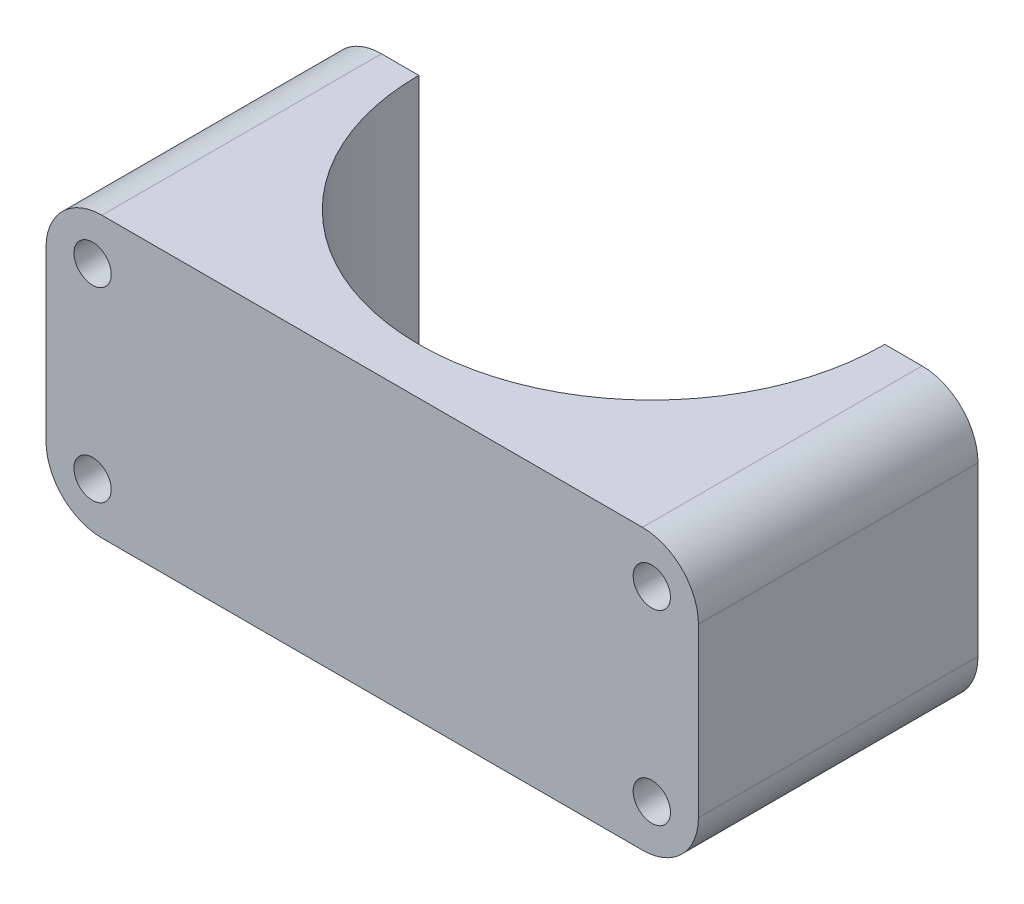
ISO-10303-21;
HEADER;
FILE_DESCRIPTION(('STEP AP214'),'2;1');
FILE_NAME('part.step','',(''),(''),'','','');
FILE_SCHEMA(('AUTOMOTIVE_DESIGN { 1 0 10303 214 1 1 1 1 }'));
ENDSEC;
DATA;
#1=APPLICATION_CONTEXT('core data for automotive mechanical design processes');
#2=APPLICATION_PROTOCOL_DEFINITION('international standard','automotive_design',2000,#1);
#3=PRODUCT_CONTEXT('',#1,'mechanical');
#4=PRODUCT('Part','Part','',(#3));
#5=PRODUCT_RELATED_PRODUCT_CATEGORY('part','',(#4));
#6=PRODUCT_DEFINITION_FORMATION('','',#4);
#7=PRODUCT_DEFINITION_CONTEXT('part definition',#1,'design');
#8=PRODUCT_DEFINITION('design','',#6,#7);
#9=PRODUCT_DEFINITION_SHAPE('','',#8);
#10=(LENGTH_UNIT() NAMED_UNIT(*) SI_UNIT(.MILLI.,.METRE.));
#11=(NAMED_UNIT(*) PLANE_ANGLE_UNIT() SI_UNIT($,.RADIAN.));
#12=(NAMED_UNIT(*) SI_UNIT($,.STERADIAN.) SOLID_ANGLE_UNIT());
#13=UNCERTAINTY_MEASURE_WITH_UNIT(LENGTH_MEASURE(1.E-05),#10,'distance_accuracy_value','');
#14=(GEOMETRIC_REPRESENTATION_CONTEXT(3) GLOBAL_UNCERTAINTY_ASSIGNED_CONTEXT((#13)) GLOBAL_UNIT_ASSIGNED_CONTEXT((#10,
#11,#12)) REPRESENTATION_CONTEXT('',''));
#15=CARTESIAN_POINT('',(0.,0.,0.));
#16=DIRECTION('',(0.,0.,1.));
#17=DIRECTION('',(1.,0.,0.));
#18=AXIS2_PLACEMENT_3D('',#15,#16,#17);
#19=CARTESIAN_POINT('',(17.5,15.,-15.));
#20=DIRECTION('',(0.,-1.,0.));
#21=DIRECTION('',(0.,0.,-1.));
#22=AXIS2_PLACEMENT_3D('',#19,#20,#21);
#23=CYLINDRICAL_SURFACE('',#22,12.5);
#24=CARTESIAN_POINT('',(17.5,0.,-15.));
#25=DIRECTION('',(0.,1.,0.));
#26=DIRECTION('',(0.,0.,1.));
#27=AXIS2_PLACEMENT_3D('',#24,#25,#26);
#28=CIRCLE('',#27,12.5);
#29=CARTESIAN_POINT('',(5.,0.,-15.));
#30=VERTEX_POINT('',#29);
#31=CARTESIAN_POINT('',(30.,0.,-15.));
#32=VERTEX_POINT('',#31);
#33=EDGE_CURVE('E131',#30,#32,#28,.T.);
#34=ORIENTED_EDGE('',*,*,#33,.F.);
#35=DIRECTION('',(0.,-1.,0.));
#36=VECTOR('',#35,1.);
#37=CARTESIAN_POINT('',(5.,15.,-15.));
#38=LINE('',#37,#36);
#39=CARTESIAN_POINT('',(5.,15.,-15.));
#40=VERTEX_POINT('',#39);
#41=EDGE_CURVE('E117',#40,#30,#38,.T.);
#42=ORIENTED_EDGE('',*,*,#41,.F.);
#43=CARTESIAN_POINT('',(17.5,15.,-15.));
#44=DIRECTION('',(0.,1.,0.));
#45=DIRECTION('',(0.,0.,1.));
#46=AXIS2_PLACEMENT_3D('',#43,#44,#45);
#47=CIRCLE('',#46,12.5);
#48=CARTESIAN_POINT('',(30.,15.,-15.));
#49=VERTEX_POINT('',#48);
#50=EDGE_CURVE('E124',#40,#49,#47,.T.);
#51=ORIENTED_EDGE('',*,*,#50,.T.);
#52=DIRECTION('',(0.,-1.,0.));
#53=VECTOR('',#52,1.);
#54=CARTESIAN_POINT('',(30.,15.,-15.));
#55=LINE('',#54,#53);
#56=EDGE_CURVE('E153',#49,#32,#55,.T.);
#57=ORIENTED_EDGE('',*,*,#56,.T.);
#58=EDGE_LOOP('',(#34,#42,#51,#57));
#59=FACE_BOUND('',#58,.T.);
#60=ADVANCED_FACE('F33',(#59),#23,.F.);
#61=CARTESIAN_POINT('',(0.,15.,-15.));
#62=DIRECTION('',(0.,0.,-1.));
#63=DIRECTION('',(-1.,0.,0.));
#64=AXIS2_PLACEMENT_3D('',#61,#62,#63);
#65=PLANE('',#64);
#66=CARTESIAN_POINT('',(2.5,12.5,-15.));
#67=DIRECTION('',(0.,0.,-1.));
#68=DIRECTION('',(1.,0.,0.));
#69=AXIS2_PLACEMENT_3D('',#66,#67,#68);
#70=CIRCLE('',#69,0.999999999999998);
#71=CARTESIAN_POINT('',(3.5,12.5,-15.));
#72=VERTEX_POINT('',#71);
#73=EDGE_CURVE('E294',#72,#72,#70,.T.);
#74=ORIENTED_EDGE('',*,*,#73,.F.);
#75=EDGE_LOOP('',(#74));
#76=FACE_BOUND('',#75,.T.);
#77=CARTESIAN_POINT('',(2.5,2.5,-15.));
#78=DIRECTION('',(0.,0.,-1.));
#79=DIRECTION('',(-1.,0.,0.));
#80=AXIS2_PLACEMENT_3D('',#77,#78,#79);
#81=CIRCLE('',#80,0.999999999999998);
#82=CARTESIAN_POINT('',(1.5,2.5,-15.));
#83=VERTEX_POINT('',#82);
#84=EDGE_CURVE('E290',#83,#83,#81,.T.);
#85=ORIENTED_EDGE('',*,*,#84,.F.);
#86=EDGE_LOOP('',(#85));
#87=FACE_BOUND('',#86,.T.);
#88=DIRECTION('',(0.,-1.,0.));
#89=VECTOR('',#88,1.);
#90=CARTESIAN_POINT('',(0.,15.,-15.));
#91=LINE('',#90,#89);
#92=CARTESIAN_POINT('',(0.,12.,-15.));
#93=VERTEX_POINT('',#92);
#94=CARTESIAN_POINT('',(0.,3.,-15.));
#95=VERTEX_POINT('',#94);
#96=EDGE_CURVE('E133',#93,#95,#91,.T.);
#97=ORIENTED_EDGE('',*,*,#96,.F.);
#98=CARTESIAN_POINT('',(3.,12.,-15.));
#99=DIRECTION('',(0.,0.,-1.));
#100=DIRECTION('',(-1.,0.,0.));
#101=AXIS2_PLACEMENT_3D('',#98,#99,#100);
#102=CIRCLE('',#101,3.);
#103=CARTESIAN_POINT('',(3.,15.,-15.));
#104=VERTEX_POINT('',#103);
#105=EDGE_CURVE('E119',#93,#104,#102,.T.);
#106=ORIENTED_EDGE('',*,*,#105,.T.);
#107=DIRECTION('',(1.,0.,0.));
#108=VECTOR('',#107,1.);
#109=CARTESIAN_POINT('',(0.,15.,-15.));
#110=LINE('',#109,#108);
#111=EDGE_CURVE('E112',#104,#40,#110,.T.);
#112=ORIENTED_EDGE('',*,*,#111,.T.);
#113=ORIENTED_EDGE('',*,*,#41,.T.);
#114=DIRECTION('',(1.,0.,0.));
#115=VECTOR('',#114,1.);
#116=CARTESIAN_POINT('',(0.,0.,-15.));
#117=LINE('',#116,#115);
#118=CARTESIAN_POINT('',(3.,0.,-15.));
#119=VERTEX_POINT('',#118);
#120=EDGE_CURVE('E142',#119,#30,#117,.T.);
#121=ORIENTED_EDGE('',*,*,#120,.F.);
#122=CARTESIAN_POINT('',(3.,3.,-15.));
#123=DIRECTION('',(0.,0.,-1.));
#124=DIRECTION('',(-1.,0.,0.));
#125=AXIS2_PLACEMENT_3D('',#122,#123,#124);
#126=CIRCLE('',#125,3.);
#127=EDGE_CURVE('E169',#119,#95,#126,.T.);
#128=ORIENTED_EDGE('',*,*,#127,.T.);
#129=EDGE_LOOP('',(#97,#106,#112,#113,#121,#128));
#130=FACE_BOUND('',#129,.T.);
#131=ADVANCED_FACE('F115',(#76,#87,#130),#65,.T.);
#132=CARTESIAN_POINT('',(0.,15.,0.));
#133=DIRECTION('',(-1.,0.,0.));
#134=DIRECTION('',(0.,0.,1.));
#135=AXIS2_PLACEMENT_3D('',#132,#133,#134);
#136=PLANE('',#135);
#137=DIRECTION('',(0.,-1.,0.));
#138=VECTOR('',#137,1.);
#139=CARTESIAN_POINT('',(0.,15.,0.));
#140=LINE('',#139,#138);
#141=CARTESIAN_POINT('',(0.,12.,0.));
#142=VERTEX_POINT('',#141);
#143=CARTESIAN_POINT('',(0.,3.,0.));
#144=VERTEX_POINT('',#143);
#145=EDGE_CURVE('E160',#142,#144,#140,.T.);
#146=ORIENTED_EDGE('',*,*,#145,.F.);
#147=DIRECTION('',(0.,0.,-1.));
#148=VECTOR('',#147,1.);
#149=CARTESIAN_POINT('',(0.,12.,0.));
#150=LINE('',#149,#148);
#151=EDGE_CURVE('E166',#142,#93,#150,.T.);
#152=ORIENTED_EDGE('',*,*,#151,.T.);
#153=ORIENTED_EDGE('',*,*,#96,.T.);
#154=DIRECTION('',(0.,0.,-1.));
#155=VECTOR('',#154,1.);
#156=CARTESIAN_POINT('',(0.,3.,0.));
#157=LINE('',#156,#155);
#158=EDGE_CURVE('E132',#95,#144,#157,.F.);
#159=ORIENTED_EDGE('',*,*,#158,.T.);
#160=EDGE_LOOP('',(#146,#152,#153,#159));
#161=FACE_BOUND('',#160,.T.);
#162=ADVANCED_FACE('F208',(#161),#136,.T.);
#163=CARTESIAN_POINT('',(0.,15.,0.));
#164=DIRECTION('',(0.,0.,-1.));
#165=DIRECTION('',(-1.,0.,0.));
#166=AXIS2_PLACEMENT_3D('',#163,#164,#165);
#167=PLANE('',#166);
#168=CARTESIAN_POINT('',(2.5,12.5,0.));
#169=DIRECTION('',(0.,0.,-1.));
#170=DIRECTION('',(1.,0.,0.));
#171=AXIS2_PLACEMENT_3D('',#168,#169,#170);
#172=CIRCLE('',#171,0.999999999999998);
#173=CARTESIAN_POINT('',(3.5,12.5,0.));
#174=VERTEX_POINT('',#173);
#175=EDGE_CURVE('E273',#174,#174,#172,.T.);
#176=ORIENTED_EDGE('',*,*,#175,.T.);
#177=EDGE_LOOP('',(#176));
#178=FACE_BOUND('',#177,.T.);
#179=CARTESIAN_POINT('',(2.5,2.5,0.));
#180=DIRECTION('',(0.,0.,-1.));
#181=DIRECTION('',(-1.,0.,0.));
#182=AXIS2_PLACEMENT_3D('',#179,#180,#181);
#183=CIRCLE('',#182,0.999999999999998);
#184=CARTESIAN_POINT('',(1.5,2.5,0.));
#185=VERTEX_POINT('',#184);
#186=EDGE_CURVE('E277',#185,#185,#183,.T.);
#187=ORIENTED_EDGE('',*,*,#186,.T.);
#188=EDGE_LOOP('',(#187));
#189=FACE_BOUND('',#188,.T.);
#190=CARTESIAN_POINT('',(32.5,2.5,0.));
#191=DIRECTION('',(0.,0.,-1.));
#192=DIRECTION('',(1.,0.,0.));
#193=AXIS2_PLACEMENT_3D('',#190,#191,#192);
#194=CIRCLE('',#193,0.999999999999998);
#195=CARTESIAN_POINT('',(33.5,2.5,0.));
#196=VERTEX_POINT('',#195);
#197=EDGE_CURVE('E281',#196,#196,#194,.T.);
#198=ORIENTED_EDGE('',*,*,#197,.T.);
#199=EDGE_LOOP('',(#198));
#200=FACE_BOUND('',#199,.T.);
#201=CARTESIAN_POINT('',(32.5,12.5,0.));
#202=DIRECTION('',(0.,0.,-1.));
#203=DIRECTION('',(-1.,0.,0.));
#204=AXIS2_PLACEMENT_3D('',#201,#202,#203);
#205=CIRCLE('',#204,0.999999999999998);
#206=CARTESIAN_POINT('',(31.5,12.5,0.));
#207=VERTEX_POINT('',#206);
#208=EDGE_CURVE('E149',#207,#207,#205,.T.);
#209=ORIENTED_EDGE('',*,*,#208,.T.);
#210=EDGE_LOOP('',(#209));
#211=FACE_BOUND('',#210,.T.);
#212=DIRECTION('',(1.,0.,0.));
#213=VECTOR('',#212,1.);
#214=CARTESIAN_POINT('',(0.,15.,0.));
#215=LINE('',#214,#213);
#216=CARTESIAN_POINT('',(3.,15.,0.));
#217=VERTEX_POINT('',#216);
#218=CARTESIAN_POINT('',(32.,15.,0.));
#219=VERTEX_POINT('',#218);
#220=EDGE_CURVE('E123',#217,#219,#215,.T.);
#221=ORIENTED_EDGE('',*,*,#220,.F.);
#222=CARTESIAN_POINT('',(3.,12.,0.));
#223=DIRECTION('',(0.,0.,-1.));
#224=DIRECTION('',(-1.,0.,0.));
#225=AXIS2_PLACEMENT_3D('',#222,#223,#224);
#226=CIRCLE('',#225,3.);
#227=EDGE_CURVE('E182',#217,#142,#226,.F.);
#228=ORIENTED_EDGE('',*,*,#227,.T.);
#229=ORIENTED_EDGE('',*,*,#145,.T.);
#230=CARTESIAN_POINT('',(3.,3.,0.));
#231=DIRECTION('',(0.,0.,-1.));
#232=DIRECTION('',(-1.,0.,0.));
#233=AXIS2_PLACEMENT_3D('',#230,#231,#232);
#234=CIRCLE('',#233,3.);
#235=CARTESIAN_POINT('',(3.,0.,0.));
#236=VERTEX_POINT('',#235);
#237=EDGE_CURVE('E178',#144,#236,#234,.F.);
#238=ORIENTED_EDGE('',*,*,#237,.T.);
#239=DIRECTION('',(1.,0.,0.));
#240=VECTOR('',#239,1.);
#241=CARTESIAN_POINT('',(0.,0.,0.));
#242=LINE('',#241,#240);
#243=CARTESIAN_POINT('',(32.,0.,0.));
#244=VERTEX_POINT('',#243);
#245=EDGE_CURVE('E140',#236,#244,#242,.T.);
#246=ORIENTED_EDGE('',*,*,#245,.T.);
#247=CARTESIAN_POINT('',(32.,3.,0.));
#248=DIRECTION('',(0.,0.,-1.));
#249=DIRECTION('',(-1.,0.,0.));
#250=AXIS2_PLACEMENT_3D('',#247,#248,#249);
#251=CIRCLE('',#250,3.);
#252=CARTESIAN_POINT('',(35.,3.,0.));
#253=VERTEX_POINT('',#252);
#254=EDGE_CURVE('E176',#244,#253,#251,.F.);
#255=ORIENTED_EDGE('',*,*,#254,.T.);
#256=DIRECTION('',(0.,-1.,0.));
#257=VECTOR('',#256,1.);
#258=CARTESIAN_POINT('',(35.,15.,0.));
#259=LINE('',#258,#257);
#260=CARTESIAN_POINT('',(35.,12.,0.));
#261=VERTEX_POINT('',#260);
#262=EDGE_CURVE('E157',#261,#253,#259,.T.);
#263=ORIENTED_EDGE('',*,*,#262,.F.);
#264=CARTESIAN_POINT('',(32.,12.,0.));
#265=DIRECTION('',(0.,0.,-1.));
#266=DIRECTION('',(-1.,0.,0.));
#267=AXIS2_PLACEMENT_3D('',#264,#265,#266);
#268=CIRCLE('',#267,3.);
#269=EDGE_CURVE('E180',#261,#219,#268,.F.);
#270=ORIENTED_EDGE('',*,*,#269,.T.);
#271=EDGE_LOOP('',(#221,#228,#229,#238,#246,#255,#263,#270));
#272=FACE_BOUND('',#271,.T.);
#273=ADVANCED_FACE('F197',(#178,#189,#200,#211,#272),#167,.F.);
#274=CARTESIAN_POINT('',(35.,15.,0.));
#275=DIRECTION('',(-1.,0.,0.));
#276=DIRECTION('',(0.,0.,1.));
#277=AXIS2_PLACEMENT_3D('',#274,#275,#276);
#278=PLANE('',#277);
#279=DIRECTION('',(0.,-1.,0.));
#280=VECTOR('',#279,1.);
#281=CARTESIAN_POINT('',(35.,15.,-15.));
#282=LINE('',#281,#280);
#283=CARTESIAN_POINT('',(35.,12.,-15.));
#284=VERTEX_POINT('',#283);
#285=CARTESIAN_POINT('',(35.,3.,-15.));
#286=VERTEX_POINT('',#285);
#287=EDGE_CURVE('E155',#284,#286,#282,.T.);
#288=ORIENTED_EDGE('',*,*,#287,.F.);
#289=DIRECTION('',(0.,0.,-1.));
#290=VECTOR('',#289,1.);
#291=CARTESIAN_POINT('',(35.,12.,0.));
#292=LINE('',#291,#290);
#293=EDGE_CURVE('E188',#284,#261,#292,.F.);
#294=ORIENTED_EDGE('',*,*,#293,.T.);
#295=ORIENTED_EDGE('',*,*,#262,.T.);
#296=DIRECTION('',(0.,0.,-1.));
#297=VECTOR('',#296,1.);
#298=CARTESIAN_POINT('',(35.,3.,0.));
#299=LINE('',#298,#297);
#300=EDGE_CURVE('E186',#253,#286,#299,.T.);
#301=ORIENTED_EDGE('',*,*,#300,.T.);
#302=EDGE_LOOP('',(#288,#294,#295,#301));
#303=FACE_BOUND('',#302,.T.);
#304=ADVANCED_FACE('F201',(#303),#278,.F.);
#305=CARTESIAN_POINT('',(32.5,2.5,-15.));
#306=DIRECTION('',(0.,0.,-1.));
#307=DIRECTION('',(1.,0.,0.));
#308=AXIS2_PLACEMENT_3D('',#305,#306,#307);
#309=CIRCLE('',#308,0.999999999999998);
#310=CARTESIAN_POINT('',(33.5,2.5,-15.));
#311=VERTEX_POINT('',#310);
#312=EDGE_CURVE('E286',#311,#311,#309,.T.);
#313=ORIENTED_EDGE('',*,*,#312,.F.);
#314=EDGE_LOOP('',(#313));
#315=FACE_BOUND('',#314,.T.);
#316=CARTESIAN_POINT('',(32.5,12.5,-15.));
#317=DIRECTION('',(0.,0.,-1.));
#318=DIRECTION('',(-1.,0.,0.));
#319=AXIS2_PLACEMENT_3D('',#316,#317,#318);
#320=CIRCLE('',#319,0.999999999999998);
#321=CARTESIAN_POINT('',(31.5,12.5,-15.));
#322=VERTEX_POINT('',#321);
#323=EDGE_CURVE('E144',#322,#322,#320,.T.);
#324=ORIENTED_EDGE('',*,*,#323,.F.);
#325=EDGE_LOOP('',(#324));
#326=FACE_BOUND('',#325,.T.);
#327=CARTESIAN_POINT('',(32.,15.,-15.));
#328=VERTEX_POINT('',#327);
#329=EDGE_CURVE('E126',#49,#328,#110,.T.);
#330=ORIENTED_EDGE('',*,*,#329,.T.);
#331=CARTESIAN_POINT('',(32.,12.,-15.));
#332=DIRECTION('',(0.,0.,-1.));
#333=DIRECTION('',(-1.,0.,0.));
#334=AXIS2_PLACEMENT_3D('',#331,#332,#333);
#335=CIRCLE('',#334,3.);
#336=EDGE_CURVE('E56',#328,#284,#335,.T.);
#337=ORIENTED_EDGE('',*,*,#336,.T.);
#338=ORIENTED_EDGE('',*,*,#287,.T.);
#339=CARTESIAN_POINT('',(32.,3.,-15.));
#340=DIRECTION('',(0.,0.,-1.));
#341=DIRECTION('',(-1.,0.,0.));
#342=AXIS2_PLACEMENT_3D('',#339,#340,#341);
#343=CIRCLE('',#342,3.);
#344=CARTESIAN_POINT('',(32.,0.,-15.));
#345=VERTEX_POINT('',#344);
#346=EDGE_CURVE('E48',#286,#345,#343,.T.);
#347=ORIENTED_EDGE('',*,*,#346,.T.);
#348=EDGE_CURVE('E137',#32,#345,#117,.T.);
#349=ORIENTED_EDGE('',*,*,#348,.F.);
#350=ORIENTED_EDGE('',*,*,#56,.F.);
#351=EDGE_LOOP('',(#330,#337,#338,#347,#349,#350));
#352=FACE_BOUND('',#351,.T.);
#353=ADVANCED_FACE('F203',(#315,#326,#352),#65,.T.);
#354=CARTESIAN_POINT('',(0.,15.,0.));
#355=DIRECTION('',(0.,1.,0.));
#356=DIRECTION('',(0.,0.,1.));
#357=AXIS2_PLACEMENT_3D('',#354,#355,#356);
#358=PLANE('',#357);
#359=ORIENTED_EDGE('',*,*,#111,.F.);
#360=DIRECTION('',(0.,0.,-1.));
#361=VECTOR('',#360,1.);
#362=CARTESIAN_POINT('',(3.,15.,0.));
#363=LINE('',#362,#361);
#364=EDGE_CURVE('E174',#104,#217,#363,.F.);
#365=ORIENTED_EDGE('',*,*,#364,.T.);
#366=ORIENTED_EDGE('',*,*,#220,.T.);
#367=DIRECTION('',(0.,0.,-1.));
#368=VECTOR('',#367,1.);
#369=CARTESIAN_POINT('',(32.,15.,-15.));
#370=LINE('',#369,#368);
#371=EDGE_CURVE('E172',#219,#328,#370,.T.);
#372=ORIENTED_EDGE('',*,*,#371,.T.);
#373=ORIENTED_EDGE('',*,*,#329,.F.);
#374=ORIENTED_EDGE('',*,*,#50,.F.);
#375=EDGE_LOOP('',(#359,#365,#366,#372,#373,#374));
#376=FACE_BOUND('',#375,.T.);
#377=ADVANCED_FACE('F135',(#376),#358,.T.);
#378=CARTESIAN_POINT('',(0.,0.,0.));
#379=DIRECTION('',(0.,1.,0.));
#380=DIRECTION('',(0.,0.,1.));
#381=AXIS2_PLACEMENT_3D('',#378,#379,#380);
#382=PLANE('',#381);
#383=ORIENTED_EDGE('',*,*,#245,.F.);
#384=DIRECTION('',(0.,0.,-1.));
#385=VECTOR('',#384,1.);
#386=CARTESIAN_POINT('',(3.,0.,-15.));
#387=LINE('',#386,#385);
#388=EDGE_CURVE('E11',#236,#119,#387,.T.);
#389=ORIENTED_EDGE('',*,*,#388,.T.);
#390=ORIENTED_EDGE('',*,*,#120,.T.);
#391=ORIENTED_EDGE('',*,*,#33,.T.);
#392=ORIENTED_EDGE('',*,*,#348,.T.);
#393=DIRECTION('',(0.,0.,-1.));
#394=VECTOR('',#393,1.);
#395=CARTESIAN_POINT('',(32.,0.,0.));
#396=LINE('',#395,#394);
#397=EDGE_CURVE('E41',#345,#244,#396,.F.);
#398=ORIENTED_EDGE('',*,*,#397,.T.);
#399=EDGE_LOOP('',(#383,#389,#390,#391,#392,#398));
#400=FACE_BOUND('',#399,.T.);
#401=ADVANCED_FACE('F191',(#400),#382,.F.);
#402=CARTESIAN_POINT('',(32.5,12.5,0.));
#403=DIRECTION('',(0.,0.,-1.));
#404=DIRECTION('',(-1.,0.,0.));
#405=AXIS2_PLACEMENT_3D('',#402,#403,#404);
#406=CYLINDRICAL_SURFACE('',#405,0.999999999999998);
#407=ORIENTED_EDGE('',*,*,#208,.F.);
#408=EDGE_LOOP('',(#407));
#409=FACE_BOUND('',#408,.T.);
#410=ORIENTED_EDGE('',*,*,#323,.T.);
#411=EDGE_LOOP('',(#410));
#412=FACE_BOUND('',#411,.T.);
#413=ADVANCED_FACE('F254',(#409,#412),#406,.F.);
#414=CARTESIAN_POINT('',(32.5,2.5,0.));
#415=DIRECTION('',(0.,0.,-1.));
#416=DIRECTION('',(-1.,0.,0.));
#417=AXIS2_PLACEMENT_3D('',#414,#415,#416);
#418=CYLINDRICAL_SURFACE('',#417,0.999999999999998);
#419=ORIENTED_EDGE('',*,*,#197,.F.);
#420=EDGE_LOOP('',(#419));
#421=FACE_BOUND('',#420,.T.);
#422=ORIENTED_EDGE('',*,*,#312,.T.);
#423=EDGE_LOOP('',(#422));
#424=FACE_BOUND('',#423,.T.);
#425=ADVANCED_FACE('F246',(#421,#424),#418,.F.);
#426=CARTESIAN_POINT('',(2.5,2.5,0.));
#427=DIRECTION('',(0.,0.,-1.));
#428=DIRECTION('',(-1.,0.,0.));
#429=AXIS2_PLACEMENT_3D('',#426,#427,#428);
#430=CYLINDRICAL_SURFACE('',#429,0.999999999999998);
#431=ORIENTED_EDGE('',*,*,#186,.F.);
#432=EDGE_LOOP('',(#431));
#433=FACE_BOUND('',#432,.T.);
#434=ORIENTED_EDGE('',*,*,#84,.T.);
#435=EDGE_LOOP('',(#434));
#436=FACE_BOUND('',#435,.T.);
#437=ADVANCED_FACE('F237',(#433,#436),#430,.F.);
#438=CARTESIAN_POINT('',(2.5,12.5,0.));
#439=DIRECTION('',(0.,0.,-1.));
#440=DIRECTION('',(-1.,0.,0.));
#441=AXIS2_PLACEMENT_3D('',#438,#439,#440);
#442=CYLINDRICAL_SURFACE('',#441,0.999999999999998);
#443=ORIENTED_EDGE('',*,*,#175,.F.);
#444=EDGE_LOOP('',(#443));
#445=FACE_BOUND('',#444,.T.);
#446=ORIENTED_EDGE('',*,*,#73,.T.);
#447=EDGE_LOOP('',(#446));
#448=FACE_BOUND('',#447,.T.);
#449=ADVANCED_FACE('F232',(#445,#448),#442,.F.);
#450=CARTESIAN_POINT('',(3.,12.,0.));
#451=DIRECTION('',(0.,0.,-1.));
#452=DIRECTION('',(-1.,0.,0.));
#453=AXIS2_PLACEMENT_3D('',#450,#451,#452);
#454=CYLINDRICAL_SURFACE('',#453,3.);
#455=ORIENTED_EDGE('',*,*,#227,.F.);
#456=ORIENTED_EDGE('',*,*,#364,.F.);
#457=ORIENTED_EDGE('',*,*,#105,.F.);
#458=ORIENTED_EDGE('',*,*,#151,.F.);
#459=EDGE_LOOP('',(#455,#456,#457,#458));
#460=FACE_BOUND('',#459,.T.);
#461=ADVANCED_FACE('F217',(#460),#454,.T.);
#462=CARTESIAN_POINT('',(32.,12.,0.));
#463=DIRECTION('',(0.,0.,1.));
#464=DIRECTION('',(1.,0.,0.));
#465=AXIS2_PLACEMENT_3D('',#462,#463,#464);
#466=CYLINDRICAL_SURFACE('',#465,3.);
#467=ORIENTED_EDGE('',*,*,#269,.F.);
#468=ORIENTED_EDGE('',*,*,#293,.F.);
#469=ORIENTED_EDGE('',*,*,#336,.F.);
#470=ORIENTED_EDGE('',*,*,#371,.F.);
#471=EDGE_LOOP('',(#467,#468,#469,#470));
#472=FACE_BOUND('',#471,.T.);
#473=ADVANCED_FACE('F212',(#472),#466,.T.);
#474=CARTESIAN_POINT('',(3.,3.,0.));
#475=DIRECTION('',(0.,0.,1.));
#476=DIRECTION('',(1.,0.,0.));
#477=AXIS2_PLACEMENT_3D('',#474,#475,#476);
#478=CYLINDRICAL_SURFACE('',#477,3.);
#479=ORIENTED_EDGE('',*,*,#237,.F.);
#480=ORIENTED_EDGE('',*,*,#158,.F.);
#481=ORIENTED_EDGE('',*,*,#127,.F.);
#482=ORIENTED_EDGE('',*,*,#388,.F.);
#483=EDGE_LOOP('',(#479,#480,#481,#482));
#484=FACE_BOUND('',#483,.T.);
#485=ADVANCED_FACE('F210',(#484),#478,.T.);
#486=CARTESIAN_POINT('',(32.,3.,0.));
#487=DIRECTION('',(0.,0.,-1.));
#488=DIRECTION('',(-1.,0.,0.));
#489=AXIS2_PLACEMENT_3D('',#486,#487,#488);
#490=CYLINDRICAL_SURFACE('',#489,3.);
#491=ORIENTED_EDGE('',*,*,#254,.F.);
#492=ORIENTED_EDGE('',*,*,#397,.F.);
#493=ORIENTED_EDGE('',*,*,#346,.F.);
#494=ORIENTED_EDGE('',*,*,#300,.F.);
#495=EDGE_LOOP('',(#491,#492,#493,#494));
#496=FACE_BOUND('',#495,.T.);
#497=ADVANCED_FACE('F35',(#496),#490,.T.);
#498=CLOSED_SHELL('',(#60,#131,#162,#273,#304,#353,#377,#401,#413,#425,#437,#449,#461,#473,#485,#497));
#499=MANIFOLD_SOLID_BREP('B2',#498);
#500=ADVANCED_BREP_SHAPE_REPRESENTATION('',(#18,#499),#14);
#501=SHAPE_DEFINITION_REPRESENTATION(#9,#500);
ENDSEC;
END-ISO-10303-21;
